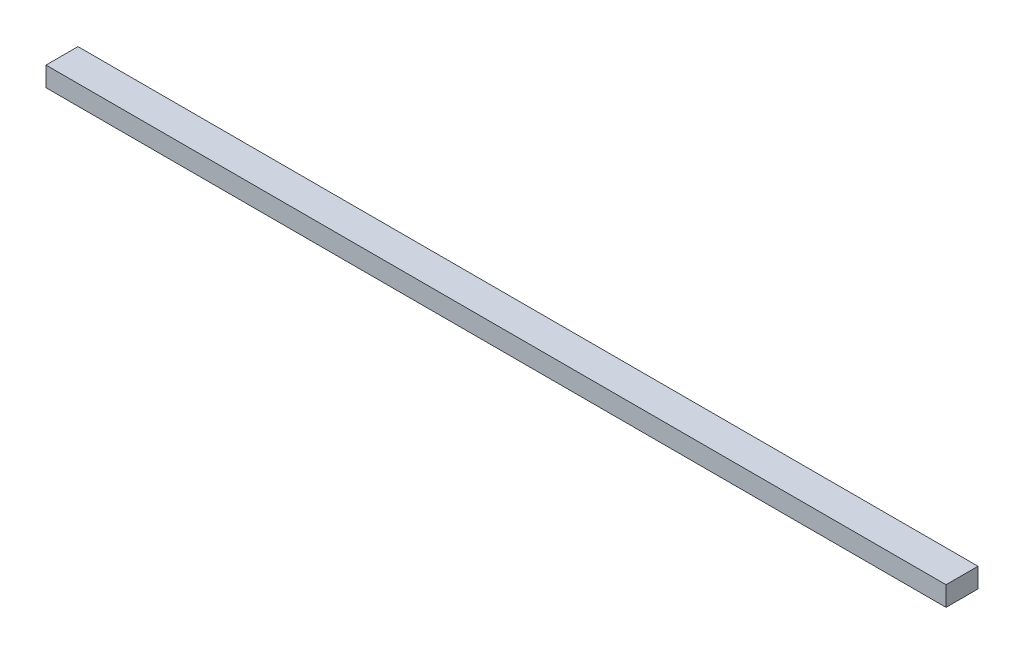
ISO-10303-21;
HEADER;
FILE_DESCRIPTION(('STEP AP214'),'2;1');
FILE_NAME('part.step','',(''),(''),'','','');
FILE_SCHEMA(('AUTOMOTIVE_DESIGN { 1 0 10303 214 1 1 1 1 }'));
ENDSEC;
DATA;
#1=APPLICATION_CONTEXT('core data for automotive mechanical design processes');
#2=APPLICATION_PROTOCOL_DEFINITION('international standard','automotive_design',2000,#1);
#3=PRODUCT_CONTEXT('',#1,'mechanical');
#4=PRODUCT('Part','Part','',(#3));
#5=PRODUCT_RELATED_PRODUCT_CATEGORY('part','',(#4));
#6=PRODUCT_DEFINITION_FORMATION('','',#4);
#7=PRODUCT_DEFINITION_CONTEXT('part definition',#1,'design');
#8=PRODUCT_DEFINITION('design','',#6,#7);
#9=PRODUCT_DEFINITION_SHAPE('','',#8);
#10=(LENGTH_UNIT() NAMED_UNIT(*) SI_UNIT(.MILLI.,.METRE.));
#11=(NAMED_UNIT(*) PLANE_ANGLE_UNIT() SI_UNIT($,.RADIAN.));
#12=(NAMED_UNIT(*) SI_UNIT($,.STERADIAN.) SOLID_ANGLE_UNIT());
#13=UNCERTAINTY_MEASURE_WITH_UNIT(LENGTH_MEASURE(1.E-05),#10,'distance_accuracy_value','');
#14=(GEOMETRIC_REPRESENTATION_CONTEXT(3) GLOBAL_UNCERTAINTY_ASSIGNED_CONTEXT((#13)) GLOBAL_UNIT_ASSIGNED_CONTEXT((#10,
#11,#12)) REPRESENTATION_CONTEXT('',''));
#15=CARTESIAN_POINT('',(0.,0.,0.));
#16=DIRECTION('',(0.,0.,1.));
#17=DIRECTION('',(1.,0.,0.));
#18=AXIS2_PLACEMENT_3D('',#15,#16,#17);
#19=CARTESIAN_POINT('',(183.,-2.,-3.25));
#20=DIRECTION('',(0.,0.,1.));
#21=DIRECTION('',(1.,0.,0.));
#22=AXIS2_PLACEMENT_3D('',#19,#20,#21);
#23=PLANE('',#22);
#24=DIRECTION('',(0.,1.,0.));
#25=VECTOR('',#24,1.);
#26=CARTESIAN_POINT('',(0.,-2.,-3.25));
#27=LINE('',#26,#25);
#28=CARTESIAN_POINT('',(0.,-2.,-3.25));
#29=VERTEX_POINT('',#28);
#30=CARTESIAN_POINT('',(0.,2.,-3.25));
#31=VERTEX_POINT('',#30);
#32=EDGE_CURVE('E100',#29,#31,#27,.T.);
#33=ORIENTED_EDGE('',*,*,#32,.T.);
#34=DIRECTION('',(-1.,0.,0.));
#35=VECTOR('',#34,1.);
#36=CARTESIAN_POINT('',(183.,2.,-3.25));
#37=LINE('',#36,#35);
#38=CARTESIAN_POINT('',(183.,2.,-3.25));
#39=VERTEX_POINT('',#38);
#40=EDGE_CURVE('E11',#39,#31,#37,.T.);
#41=ORIENTED_EDGE('',*,*,#40,.F.);
#42=DIRECTION('',(0.,1.,0.));
#43=VECTOR('',#42,1.);
#44=CARTESIAN_POINT('',(183.,-2.,-3.25));
#45=LINE('',#44,#43);
#46=CARTESIAN_POINT('',(183.,-2.,-3.25));
#47=VERTEX_POINT('',#46);
#48=EDGE_CURVE('E88',#47,#39,#45,.T.);
#49=ORIENTED_EDGE('',*,*,#48,.F.);
#50=DIRECTION('',(-1.,0.,0.));
#51=VECTOR('',#50,1.);
#52=CARTESIAN_POINT('',(183.,-2.,-3.25));
#53=LINE('',#52,#51);
#54=EDGE_CURVE('E96',#47,#29,#53,.T.);
#55=ORIENTED_EDGE('',*,*,#54,.T.);
#56=EDGE_LOOP('',(#33,#41,#49,#55));
#57=FACE_BOUND('',#56,.T.);
#58=ADVANCED_FACE('F37',(#57),#23,.F.);
#59=CARTESIAN_POINT('',(183.,2.,3.25));
#60=DIRECTION('',(0.,-1.,0.));
#61=DIRECTION('',(0.,0.,-1.));
#62=AXIS2_PLACEMENT_3D('',#59,#60,#61);
#63=PLANE('',#62);
#64=DIRECTION('',(0.,0.,1.));
#65=VECTOR('',#64,1.);
#66=CARTESIAN_POINT('',(0.,2.,3.25));
#67=LINE('',#66,#65);
#68=CARTESIAN_POINT('',(0.,2.,3.25));
#69=VERTEX_POINT('',#68);
#70=EDGE_CURVE('E92',#31,#69,#67,.T.);
#71=ORIENTED_EDGE('',*,*,#70,.T.);
#72=DIRECTION('',(-1.,0.,0.));
#73=VECTOR('',#72,1.);
#74=CARTESIAN_POINT('',(183.,2.,3.25));
#75=LINE('',#74,#73);
#76=CARTESIAN_POINT('',(183.,2.,3.25));
#77=VERTEX_POINT('',#76);
#78=EDGE_CURVE('E45',#77,#69,#75,.T.);
#79=ORIENTED_EDGE('',*,*,#78,.F.);
#80=DIRECTION('',(0.,0.,1.));
#81=VECTOR('',#80,1.);
#82=CARTESIAN_POINT('',(183.,2.,3.25));
#83=LINE('',#82,#81);
#84=EDGE_CURVE('E83',#39,#77,#83,.T.);
#85=ORIENTED_EDGE('',*,*,#84,.F.);
#86=ORIENTED_EDGE('',*,*,#40,.T.);
#87=EDGE_LOOP('',(#71,#79,#85,#86));
#88=FACE_BOUND('',#87,.T.);
#89=ADVANCED_FACE('F91',(#88),#63,.F.);
#90=CARTESIAN_POINT('',(183.,-2.,3.25));
#91=DIRECTION('',(0.,0.,-1.));
#92=DIRECTION('',(-1.,0.,0.));
#93=AXIS2_PLACEMENT_3D('',#90,#91,#92);
#94=PLANE('',#93);
#95=DIRECTION('',(0.,-1.,0.));
#96=VECTOR('',#95,1.);
#97=CARTESIAN_POINT('',(0.,-2.,3.25));
#98=LINE('',#97,#96);
#99=CARTESIAN_POINT('',(0.,-2.,3.25));
#100=VERTEX_POINT('',#99);
#101=EDGE_CURVE('E70',#69,#100,#98,.T.);
#102=ORIENTED_EDGE('',*,*,#101,.T.);
#103=DIRECTION('',(-1.,0.,0.));
#104=VECTOR('',#103,1.);
#105=CARTESIAN_POINT('',(183.,-2.,3.25));
#106=LINE('',#105,#104);
#107=CARTESIAN_POINT('',(183.,-2.,3.25));
#108=VERTEX_POINT('',#107);
#109=EDGE_CURVE('E93',#108,#100,#106,.T.);
#110=ORIENTED_EDGE('',*,*,#109,.F.);
#111=DIRECTION('',(0.,-1.,0.));
#112=VECTOR('',#111,1.);
#113=CARTESIAN_POINT('',(183.,-2.,3.25));
#114=LINE('',#113,#112);
#115=EDGE_CURVE('E86',#77,#108,#114,.T.);
#116=ORIENTED_EDGE('',*,*,#115,.F.);
#117=ORIENTED_EDGE('',*,*,#78,.T.);
#118=EDGE_LOOP('',(#102,#110,#116,#117));
#119=FACE_BOUND('',#118,.T.);
#120=ADVANCED_FACE('F94',(#119),#94,.F.);
#121=CARTESIAN_POINT('',(183.,-2.,3.25));
#122=DIRECTION('',(0.,1.,0.));
#123=DIRECTION('',(0.,0.,1.));
#124=AXIS2_PLACEMENT_3D('',#121,#122,#123);
#125=PLANE('',#124);
#126=DIRECTION('',(0.,0.,-1.));
#127=VECTOR('',#126,1.);
#128=CARTESIAN_POINT('',(0.,-2.,3.25));
#129=LINE('',#128,#127);
#130=EDGE_CURVE('E76',#100,#29,#129,.T.);
#131=ORIENTED_EDGE('',*,*,#130,.T.);
#132=ORIENTED_EDGE('',*,*,#54,.F.);
#133=DIRECTION('',(0.,0.,-1.));
#134=VECTOR('',#133,1.);
#135=CARTESIAN_POINT('',(183.,-2.,3.25));
#136=LINE('',#135,#134);
#137=EDGE_CURVE('E53',#108,#47,#136,.T.);
#138=ORIENTED_EDGE('',*,*,#137,.F.);
#139=ORIENTED_EDGE('',*,*,#109,.T.);
#140=EDGE_LOOP('',(#131,#132,#138,#139));
#141=FACE_BOUND('',#140,.T.);
#142=ADVANCED_FACE('F107',(#141),#125,.F.);
#143=CARTESIAN_POINT('',(183.,0.,0.));
#144=DIRECTION('',(-1.,0.,0.));
#145=DIRECTION('',(0.,0.,1.));
#146=AXIS2_PLACEMENT_3D('',#143,#144,#145);
#147=PLANE('',#146);
#148=ORIENTED_EDGE('',*,*,#48,.T.);
#149=ORIENTED_EDGE('',*,*,#84,.T.);
#150=ORIENTED_EDGE('',*,*,#115,.T.);
#151=ORIENTED_EDGE('',*,*,#137,.T.);
#152=EDGE_LOOP('',(#148,#149,#150,#151));
#153=FACE_BOUND('',#152,.T.);
#154=ADVANCED_FACE('F84',(#153),#147,.F.);
#155=CARTESIAN_POINT('',(0.,0.,0.));
#156=DIRECTION('',(-1.,0.,0.));
#157=DIRECTION('',(0.,0.,1.));
#158=AXIS2_PLACEMENT_3D('',#155,#156,#157);
#159=PLANE('',#158);
#160=ORIENTED_EDGE('',*,*,#32,.F.);
#161=ORIENTED_EDGE('',*,*,#130,.F.);
#162=ORIENTED_EDGE('',*,*,#101,.F.);
#163=ORIENTED_EDGE('',*,*,#70,.F.);
#164=EDGE_LOOP('',(#160,#161,#162,#163));
#165=FACE_BOUND('',#164,.T.);
#166=ADVANCED_FACE('F110',(#165),#159,.T.);
#167=CLOSED_SHELL('',(#58,#89,#120,#142,#154,#166));
#168=MANIFOLD_SOLID_BREP('B2',#167);
#169=ADVANCED_BREP_SHAPE_REPRESENTATION('',(#18,#168),#14);
#170=SHAPE_DEFINITION_REPRESENTATION(#9,#169);
ENDSEC;
END-ISO-10303-21;
